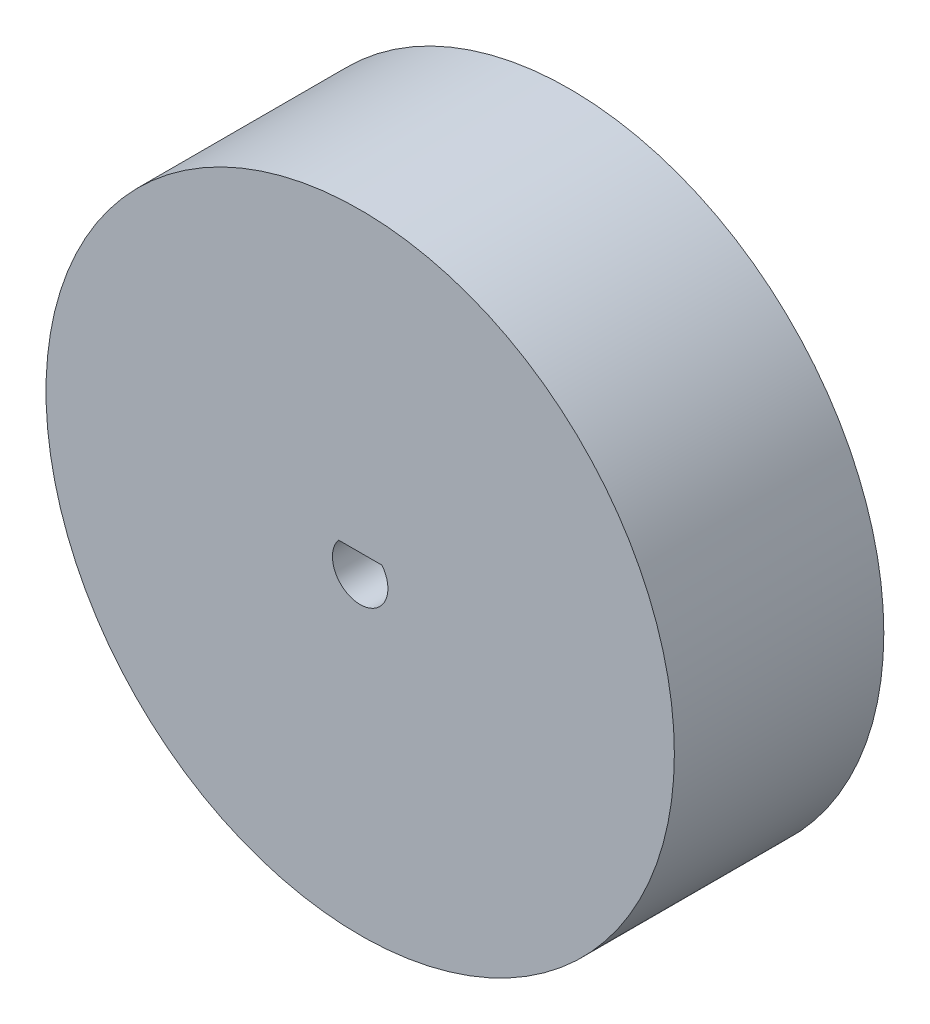
ISO-10303-21;
HEADER;
FILE_DESCRIPTION(('STEP AP214'),'2;1');
FILE_NAME('part.step','',(''),(''),'','','');
FILE_SCHEMA(('AUTOMOTIVE_DESIGN { 1 0 10303 214 1 1 1 1 }'));
ENDSEC;
DATA;
#1=APPLICATION_CONTEXT('core data for automotive mechanical design processes');
#2=APPLICATION_PROTOCOL_DEFINITION('international standard','automotive_design',2000,#1);
#3=PRODUCT_CONTEXT('',#1,'mechanical');
#4=PRODUCT('Part','Part','',(#3));
#5=PRODUCT_RELATED_PRODUCT_CATEGORY('part','',(#4));
#6=PRODUCT_DEFINITION_FORMATION('','',#4);
#7=PRODUCT_DEFINITION_CONTEXT('part definition',#1,'design');
#8=PRODUCT_DEFINITION('design','',#6,#7);
#9=PRODUCT_DEFINITION_SHAPE('','',#8);
#10=(LENGTH_UNIT() NAMED_UNIT(*) SI_UNIT(.MILLI.,.METRE.));
#11=(NAMED_UNIT(*) PLANE_ANGLE_UNIT() SI_UNIT($,.RADIAN.));
#12=(NAMED_UNIT(*) SI_UNIT($,.STERADIAN.) SOLID_ANGLE_UNIT());
#13=UNCERTAINTY_MEASURE_WITH_UNIT(LENGTH_MEASURE(1.E-05),#10,'distance_accuracy_value','');
#14=(GEOMETRIC_REPRESENTATION_CONTEXT(3) GLOBAL_UNCERTAINTY_ASSIGNED_CONTEXT((#13)) GLOBAL_UNIT_ASSIGNED_CONTEXT((#10,
#11,#12)) REPRESENTATION_CONTEXT('',''));
#15=CARTESIAN_POINT('',(0.,0.,0.));
#16=DIRECTION('',(0.,0.,1.));
#17=DIRECTION('',(1.,0.,0.));
#18=AXIS2_PLACEMENT_3D('',#15,#16,#17);
#19=CARTESIAN_POINT('',(0.,0.,20.));
#20=DIRECTION('',(0.,0.,-1.));
#21=DIRECTION('',(-1.,0.,0.));
#22=AXIS2_PLACEMENT_3D('',#19,#20,#21);
#23=CYLINDRICAL_SURFACE('',#22,30.);
#24=CARTESIAN_POINT('',(0.,0.,20.));
#25=DIRECTION('',(0.,0.,1.));
#26=DIRECTION('',(1.,0.,0.));
#27=AXIS2_PLACEMENT_3D('',#24,#25,#26);
#28=CIRCLE('',#27,30.);
#29=CARTESIAN_POINT('',(30.,0.,20.));
#30=VERTEX_POINT('',#29);
#31=EDGE_CURVE('E11',#30,#30,#28,.T.);
#32=ORIENTED_EDGE('',*,*,#31,.F.);
#33=EDGE_LOOP('',(#32));
#34=FACE_BOUND('',#33,.T.);
#35=CARTESIAN_POINT('',(0.,0.,0.));
#36=DIRECTION('',(0.,0.,1.));
#37=DIRECTION('',(1.,0.,0.));
#38=AXIS2_PLACEMENT_3D('',#35,#36,#37);
#39=CIRCLE('',#38,30.);
#40=CARTESIAN_POINT('',(30.,0.,0.));
#41=VERTEX_POINT('',#40);
#42=EDGE_CURVE('E47',#41,#41,#39,.T.);
#43=ORIENTED_EDGE('',*,*,#42,.T.);
#44=EDGE_LOOP('',(#43));
#45=FACE_BOUND('',#44,.T.);
#46=ADVANCED_FACE('F44',(#34,#45),#23,.T.);
#47=CARTESIAN_POINT('',(0.,0.,20.));
#48=DIRECTION('',(0.,0.,1.));
#49=DIRECTION('',(1.,0.,0.));
#50=AXIS2_PLACEMENT_3D('',#47,#48,#49);
#51=PLANE('',#50);
#52=CARTESIAN_POINT('',(0.,0.,20.));
#53=DIRECTION('',(0.,0.,1.));
#54=DIRECTION('',(1.,0.,0.));
#55=AXIS2_PLACEMENT_3D('',#52,#53,#54);
#56=CIRCLE('',#55,2.65);
#57=CARTESIAN_POINT('',(-2.07364413533277,1.65,20.));
#58=VERTEX_POINT('',#57);
#59=CARTESIAN_POINT('',(2.07364413533277,1.65,20.));
#60=VERTEX_POINT('',#59);
#61=EDGE_CURVE('E59',#58,#60,#56,.T.);
#62=ORIENTED_EDGE('',*,*,#61,.F.);
#63=DIRECTION('',(-1.,0.,0.));
#64=VECTOR('',#63,1.);
#65=CARTESIAN_POINT('',(-2.07364413533277,1.65,20.));
#66=LINE('',#65,#64);
#67=EDGE_CURVE('E79',#60,#58,#66,.T.);
#68=ORIENTED_EDGE('',*,*,#67,.F.);
#69=EDGE_LOOP('',(#62,#68));
#70=FACE_BOUND('',#69,.T.);
#71=ORIENTED_EDGE('',*,*,#31,.T.);
#72=EDGE_LOOP('',(#71));
#73=FACE_BOUND('',#72,.T.);
#74=ADVANCED_FACE('F84',(#70,#73),#51,.T.);
#75=CARTESIAN_POINT('',(0.,0.,0.));
#76=DIRECTION('',(0.,0.,1.));
#77=DIRECTION('',(1.,0.,0.));
#78=AXIS2_PLACEMENT_3D('',#75,#76,#77);
#79=PLANE('',#78);
#80=DIRECTION('',(-1.,0.,0.));
#81=VECTOR('',#80,1.);
#82=CARTESIAN_POINT('',(-2.07364413533277,1.65,0.));
#83=LINE('',#82,#81);
#84=CARTESIAN_POINT('',(2.07364413533277,1.65,0.));
#85=VERTEX_POINT('',#84);
#86=CARTESIAN_POINT('',(-2.07364413533277,1.65,0.));
#87=VERTEX_POINT('',#86);
#88=EDGE_CURVE('E89',#85,#87,#83,.T.);
#89=ORIENTED_EDGE('',*,*,#88,.T.);
#90=CARTESIAN_POINT('',(0.,0.,0.));
#91=DIRECTION('',(0.,0.,1.));
#92=DIRECTION('',(1.,0.,0.));
#93=AXIS2_PLACEMENT_3D('',#90,#91,#92);
#94=CIRCLE('',#93,2.65);
#95=EDGE_CURVE('E64',#87,#85,#94,.T.);
#96=ORIENTED_EDGE('',*,*,#95,.T.);
#97=EDGE_LOOP('',(#89,#96));
#98=FACE_BOUND('',#97,.T.);
#99=ORIENTED_EDGE('',*,*,#42,.F.);
#100=EDGE_LOOP('',(#99));
#101=FACE_BOUND('',#100,.T.);
#102=ADVANCED_FACE('F96',(#98,#101),#79,.F.);
#103=CARTESIAN_POINT('',(0.,0.,0.));
#104=DIRECTION('',(0.,0.,1.));
#105=DIRECTION('',(1.,0.,0.));
#106=AXIS2_PLACEMENT_3D('',#103,#104,#105);
#107=CYLINDRICAL_SURFACE('',#106,2.65);
#108=ORIENTED_EDGE('',*,*,#61,.T.);
#109=DIRECTION('',(0.,0.,1.));
#110=VECTOR('',#109,1.);
#111=CARTESIAN_POINT('',(2.07364413533277,1.65,0.));
#112=LINE('',#111,#110);
#113=EDGE_CURVE('E76',#85,#60,#112,.T.);
#114=ORIENTED_EDGE('',*,*,#113,.F.);
#115=ORIENTED_EDGE('',*,*,#95,.F.);
#116=DIRECTION('',(0.,0.,1.));
#117=VECTOR('',#116,1.);
#118=CARTESIAN_POINT('',(-2.07364413533277,1.65,0.));
#119=LINE('',#118,#117);
#120=EDGE_CURVE('E69',#87,#58,#119,.T.);
#121=ORIENTED_EDGE('',*,*,#120,.T.);
#122=EDGE_LOOP('',(#108,#114,#115,#121));
#123=FACE_BOUND('',#122,.T.);
#124=ADVANCED_FACE('F71',(#123),#107,.F.);
#125=CARTESIAN_POINT('',(-2.07364413533277,1.65,0.));
#126=DIRECTION('',(0.,1.,0.));
#127=DIRECTION('',(-1.,0.,0.));
#128=AXIS2_PLACEMENT_3D('',#125,#126,#127);
#129=PLANE('',#128);
#130=ORIENTED_EDGE('',*,*,#67,.T.);
#131=ORIENTED_EDGE('',*,*,#120,.F.);
#132=ORIENTED_EDGE('',*,*,#88,.F.);
#133=ORIENTED_EDGE('',*,*,#113,.T.);
#134=EDGE_LOOP('',(#130,#131,#132,#133));
#135=FACE_BOUND('',#134,.T.);
#136=ADVANCED_FACE('F80',(#135),#129,.F.);
#137=CLOSED_SHELL('',(#46,#74,#102,#124,#136));
#138=MANIFOLD_SOLID_BREP('B2',#137);
#139=ADVANCED_BREP_SHAPE_REPRESENTATION('',(#18,#138),#14);
#140=SHAPE_DEFINITION_REPRESENTATION(#9,#139);
ENDSEC;
END-ISO-10303-21;
